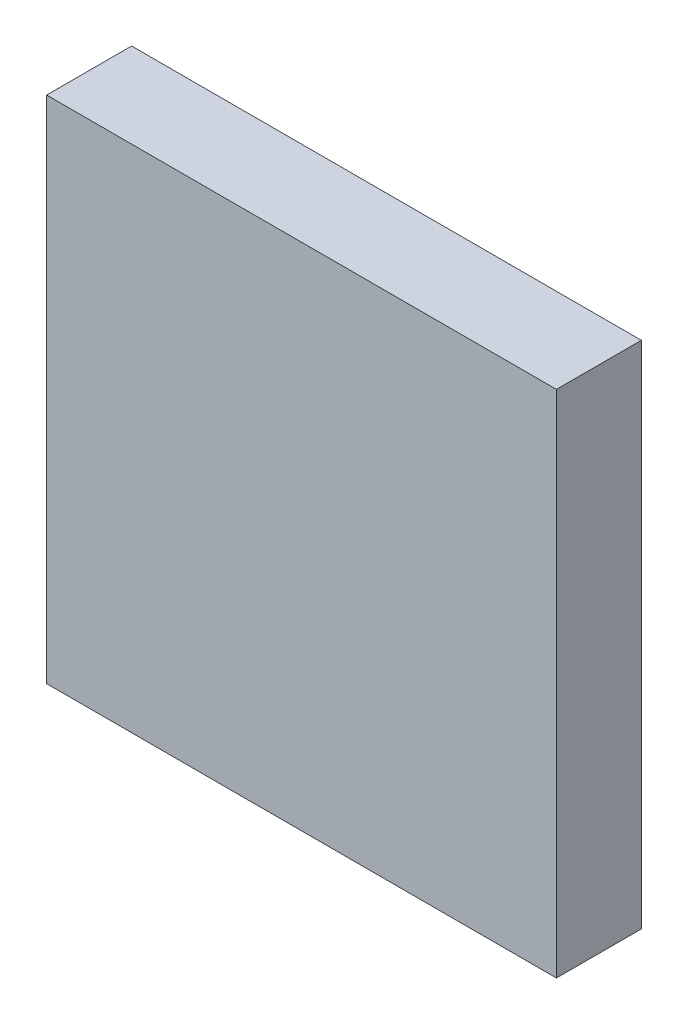
ISO-10303-21;
HEADER;
FILE_DESCRIPTION(('STEP AP214'),'2;1');
FILE_NAME('part.step','',(''),(''),'','','');
FILE_SCHEMA(('AUTOMOTIVE_DESIGN { 1 0 10303 214 1 1 1 1 }'));
ENDSEC;
DATA;
#1=APPLICATION_CONTEXT('core data for automotive mechanical design processes');
#2=APPLICATION_PROTOCOL_DEFINITION('international standard','automotive_design',2000,#1);
#3=PRODUCT_CONTEXT('',#1,'mechanical');
#4=PRODUCT('Part','Part','',(#3));
#5=PRODUCT_RELATED_PRODUCT_CATEGORY('part','',(#4));
#6=PRODUCT_DEFINITION_FORMATION('','',#4);
#7=PRODUCT_DEFINITION_CONTEXT('part definition',#1,'design');
#8=PRODUCT_DEFINITION('design','',#6,#7);
#9=PRODUCT_DEFINITION_SHAPE('','',#8);
#10=(LENGTH_UNIT() NAMED_UNIT(*) SI_UNIT(.MILLI.,.METRE.));
#11=(NAMED_UNIT(*) PLANE_ANGLE_UNIT() SI_UNIT($,.RADIAN.));
#12=(NAMED_UNIT(*) SI_UNIT($,.STERADIAN.) SOLID_ANGLE_UNIT());
#13=UNCERTAINTY_MEASURE_WITH_UNIT(LENGTH_MEASURE(1.E-05),#10,'distance_accuracy_value','');
#14=(GEOMETRIC_REPRESENTATION_CONTEXT(3) GLOBAL_UNCERTAINTY_ASSIGNED_CONTEXT((#13)) GLOBAL_UNIT_ASSIGNED_CONTEXT((#10,
#11,#12)) REPRESENTATION_CONTEXT('',''));
#15=CARTESIAN_POINT('',(0.,0.,0.));
#16=DIRECTION('',(0.,0.,1.));
#17=DIRECTION('',(1.,0.,0.));
#18=AXIS2_PLACEMENT_3D('',#15,#16,#17);
#19=CARTESIAN_POINT('',(-7.5,-7.5,2.5));
#20=DIRECTION('',(1.,0.,0.));
#21=DIRECTION('',(0.,0.,-1.));
#22=AXIS2_PLACEMENT_3D('',#19,#20,#21);
#23=PLANE('',#22);
#24=DIRECTION('',(0.,-1.,0.));
#25=VECTOR('',#24,1.);
#26=CARTESIAN_POINT('',(-7.5,-7.5,0.));
#27=LINE('',#26,#25);
#28=CARTESIAN_POINT('',(-7.5,7.5,0.));
#29=VERTEX_POINT('',#28);
#30=CARTESIAN_POINT('',(-7.5,-7.5,0.));
#31=VERTEX_POINT('',#30);
#32=EDGE_CURVE('E113',#29,#31,#27,.T.);
#33=ORIENTED_EDGE('',*,*,#32,.T.);
#34=DIRECTION('',(0.,0.,-1.));
#35=VECTOR('',#34,1.);
#36=CARTESIAN_POINT('',(-7.5,-7.5,2.5));
#37=LINE('',#36,#35);
#38=CARTESIAN_POINT('',(-7.5,-7.5,2.5));
#39=VERTEX_POINT('',#38);
#40=EDGE_CURVE('E11',#39,#31,#37,.T.);
#41=ORIENTED_EDGE('',*,*,#40,.F.);
#42=DIRECTION('',(0.,-1.,0.));
#43=VECTOR('',#42,1.);
#44=CARTESIAN_POINT('',(-7.5,-7.5,2.5));
#45=LINE('',#44,#43);
#46=CARTESIAN_POINT('',(-7.5,7.5,2.5));
#47=VERTEX_POINT('',#46);
#48=EDGE_CURVE('E97',#47,#39,#45,.T.);
#49=ORIENTED_EDGE('',*,*,#48,.F.);
#50=DIRECTION('',(0.,0.,-1.));
#51=VECTOR('',#50,1.);
#52=CARTESIAN_POINT('',(-7.5,7.5,2.5));
#53=LINE('',#52,#51);
#54=EDGE_CURVE('E112',#47,#29,#53,.T.);
#55=ORIENTED_EDGE('',*,*,#54,.T.);
#56=EDGE_LOOP('',(#33,#41,#49,#55));
#57=FACE_BOUND('',#56,.T.);
#58=ADVANCED_FACE('F50',(#57),#23,.F.);
#59=CARTESIAN_POINT('',(7.5,-7.5,2.5));
#60=DIRECTION('',(0.,1.,0.));
#61=DIRECTION('',(-1.,0.,0.));
#62=AXIS2_PLACEMENT_3D('',#59,#60,#61);
#63=PLANE('',#62);
#64=DIRECTION('',(1.,0.,0.));
#65=VECTOR('',#64,1.);
#66=CARTESIAN_POINT('',(7.5,-7.5,0.));
#67=LINE('',#66,#65);
#68=CARTESIAN_POINT('',(7.5,-7.5,0.));
#69=VERTEX_POINT('',#68);
#70=EDGE_CURVE('E102',#31,#69,#67,.T.);
#71=ORIENTED_EDGE('',*,*,#70,.T.);
#72=DIRECTION('',(0.,0.,-1.));
#73=VECTOR('',#72,1.);
#74=CARTESIAN_POINT('',(7.5,-7.5,2.5));
#75=LINE('',#74,#73);
#76=CARTESIAN_POINT('',(7.5,-7.5,2.5));
#77=VERTEX_POINT('',#76);
#78=EDGE_CURVE('E57',#77,#69,#75,.T.);
#79=ORIENTED_EDGE('',*,*,#78,.F.);
#80=DIRECTION('',(1.,0.,0.));
#81=VECTOR('',#80,1.);
#82=CARTESIAN_POINT('',(7.5,-7.5,2.5));
#83=LINE('',#82,#81);
#84=EDGE_CURVE('E94',#39,#77,#83,.T.);
#85=ORIENTED_EDGE('',*,*,#84,.F.);
#86=ORIENTED_EDGE('',*,*,#40,.T.);
#87=EDGE_LOOP('',(#71,#79,#85,#86));
#88=FACE_BOUND('',#87,.T.);
#89=ADVANCED_FACE('F103',(#88),#63,.F.);
#90=CARTESIAN_POINT('',(7.5,-7.5,2.5));
#91=DIRECTION('',(-1.,0.,0.));
#92=DIRECTION('',(0.,0.,1.));
#93=AXIS2_PLACEMENT_3D('',#90,#91,#92);
#94=PLANE('',#93);
#95=DIRECTION('',(0.,1.,0.));
#96=VECTOR('',#95,1.);
#97=CARTESIAN_POINT('',(7.5,-7.5,0.));
#98=LINE('',#97,#96);
#99=CARTESIAN_POINT('',(7.5,7.5,0.));
#100=VERTEX_POINT('',#99);
#101=EDGE_CURVE('E82',#69,#100,#98,.T.);
#102=ORIENTED_EDGE('',*,*,#101,.T.);
#103=DIRECTION('',(0.,0.,-1.));
#104=VECTOR('',#103,1.);
#105=CARTESIAN_POINT('',(7.5,7.5,2.5));
#106=LINE('',#105,#104);
#107=CARTESIAN_POINT('',(7.5,7.5,2.5));
#108=VERTEX_POINT('',#107);
#109=EDGE_CURVE('E106',#108,#100,#106,.T.);
#110=ORIENTED_EDGE('',*,*,#109,.F.);
#111=DIRECTION('',(0.,1.,0.));
#112=VECTOR('',#111,1.);
#113=CARTESIAN_POINT('',(7.5,-7.5,2.5));
#114=LINE('',#113,#112);
#115=EDGE_CURVE('E100',#77,#108,#114,.T.);
#116=ORIENTED_EDGE('',*,*,#115,.F.);
#117=ORIENTED_EDGE('',*,*,#78,.T.);
#118=EDGE_LOOP('',(#102,#110,#116,#117));
#119=FACE_BOUND('',#118,.T.);
#120=ADVANCED_FACE('F110',(#119),#94,.F.);
#121=CARTESIAN_POINT('',(7.5,7.5,2.5));
#122=DIRECTION('',(0.,-1.,0.));
#123=DIRECTION('',(1.,0.,0.));
#124=AXIS2_PLACEMENT_3D('',#121,#122,#123);
#125=PLANE('',#124);
#126=DIRECTION('',(-1.,0.,0.));
#127=VECTOR('',#126,1.);
#128=CARTESIAN_POINT('',(7.5,7.5,0.));
#129=LINE('',#128,#127);
#130=EDGE_CURVE('E87',#100,#29,#129,.T.);
#131=ORIENTED_EDGE('',*,*,#130,.T.);
#132=ORIENTED_EDGE('',*,*,#54,.F.);
#133=DIRECTION('',(-1.,0.,0.));
#134=VECTOR('',#133,1.);
#135=CARTESIAN_POINT('',(7.5,7.5,2.5));
#136=LINE('',#135,#134);
#137=EDGE_CURVE('E61',#108,#47,#136,.T.);
#138=ORIENTED_EDGE('',*,*,#137,.F.);
#139=ORIENTED_EDGE('',*,*,#109,.T.);
#140=EDGE_LOOP('',(#131,#132,#138,#139));
#141=FACE_BOUND('',#140,.T.);
#142=ADVANCED_FACE('F126',(#141),#125,.F.);
#143=CARTESIAN_POINT('',(0.,0.,2.5));
#144=DIRECTION('',(0.,0.,1.));
#145=DIRECTION('',(1.,0.,0.));
#146=AXIS2_PLACEMENT_3D('',#143,#144,#145);
#147=PLANE('',#146);
#148=ORIENTED_EDGE('',*,*,#48,.T.);
#149=ORIENTED_EDGE('',*,*,#84,.T.);
#150=ORIENTED_EDGE('',*,*,#115,.T.);
#151=ORIENTED_EDGE('',*,*,#137,.T.);
#152=EDGE_LOOP('',(#148,#149,#150,#151));
#153=FACE_BOUND('',#152,.T.);
#154=ADVANCED_FACE('F92',(#153),#147,.T.);
#155=CARTESIAN_POINT('',(0.,0.,0.));
#156=DIRECTION('',(0.,0.,1.));
#157=DIRECTION('',(1.,0.,0.));
#158=AXIS2_PLACEMENT_3D('',#155,#156,#157);
#159=PLANE('',#158);
#160=ORIENTED_EDGE('',*,*,#32,.F.);
#161=ORIENTED_EDGE('',*,*,#130,.F.);
#162=ORIENTED_EDGE('',*,*,#101,.F.);
#163=ORIENTED_EDGE('',*,*,#70,.F.);
#164=EDGE_LOOP('',(#160,#161,#162,#163));
#165=FACE_BOUND('',#164,.T.);
#166=ADVANCED_FACE('F132',(#165),#159,.F.);
#167=CLOSED_SHELL('',(#58,#89,#120,#142,#154,#166));
#168=MANIFOLD_SOLID_BREP('B2',#167);
#169=ADVANCED_BREP_SHAPE_REPRESENTATION('',(#18,#168),#14);
#170=SHAPE_DEFINITION_REPRESENTATION(#9,#169);
ENDSEC;
END-ISO-10303-21;
